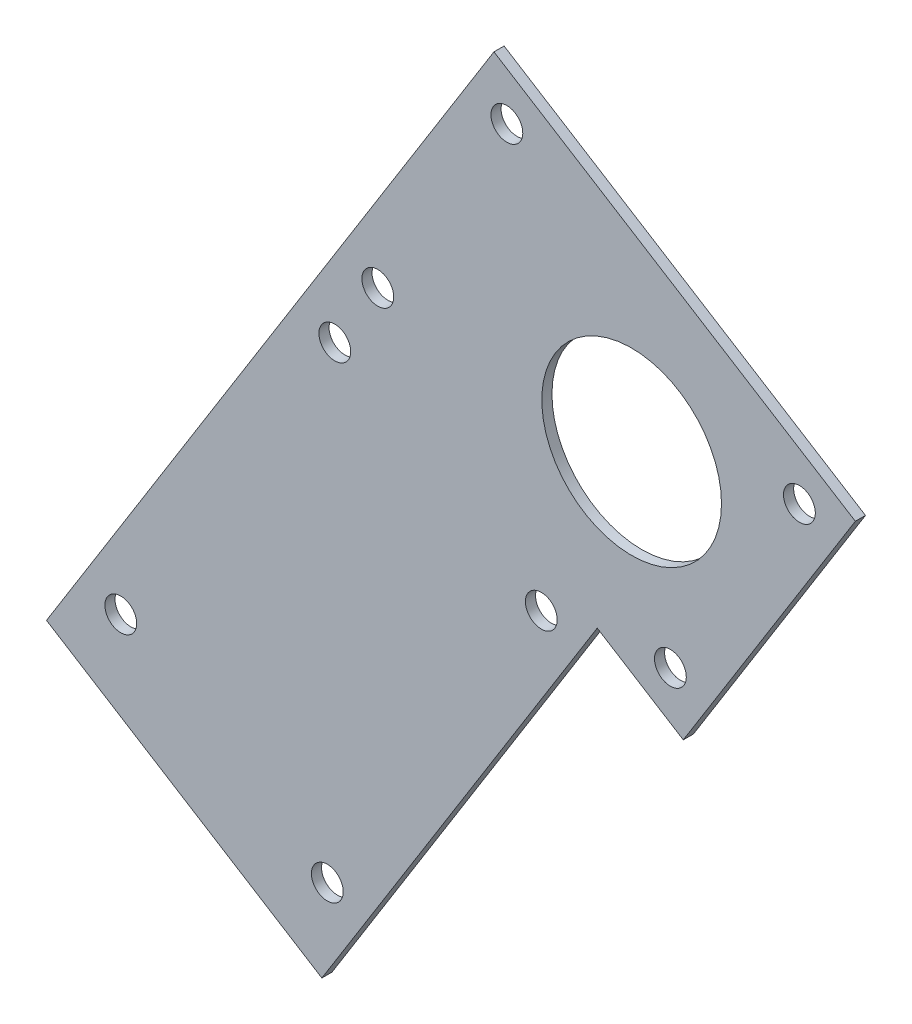
ISO-10303-21;
HEADER;
FILE_DESCRIPTION(('STEP AP214'),'2;1');
FILE_NAME('part.step','',(''),(''),'','','');
FILE_SCHEMA(('AUTOMOTIVE_DESIGN { 1 0 10303 214 1 1 1 1 }'));
ENDSEC;
DATA;
#1=APPLICATION_CONTEXT('core data for automotive mechanical design processes');
#2=APPLICATION_PROTOCOL_DEFINITION('international standard','automotive_design',2000,#1);
#3=PRODUCT_CONTEXT('',#1,'mechanical');
#4=PRODUCT('Part','Part','',(#3));
#5=PRODUCT_RELATED_PRODUCT_CATEGORY('part','',(#4));
#6=PRODUCT_DEFINITION_FORMATION('','',#4);
#7=PRODUCT_DEFINITION_CONTEXT('part definition',#1,'design');
#8=PRODUCT_DEFINITION('design','',#6,#7);
#9=PRODUCT_DEFINITION_SHAPE('','',#8);
#10=(LENGTH_UNIT() NAMED_UNIT(*) SI_UNIT(.MILLI.,.METRE.));
#11=(NAMED_UNIT(*) PLANE_ANGLE_UNIT() SI_UNIT($,.RADIAN.));
#12=(NAMED_UNIT(*) SI_UNIT($,.STERADIAN.) SOLID_ANGLE_UNIT());
#13=UNCERTAINTY_MEASURE_WITH_UNIT(LENGTH_MEASURE(1.E-05),#10,'distance_accuracy_value','');
#14=(GEOMETRIC_REPRESENTATION_CONTEXT(3) GLOBAL_UNCERTAINTY_ASSIGNED_CONTEXT((#13)) GLOBAL_UNIT_ASSIGNED_CONTEXT((#10,
#11,#12)) REPRESENTATION_CONTEXT('',''));
#15=CARTESIAN_POINT('',(0.,0.,0.));
#16=DIRECTION('',(0.,0.,1.));
#17=DIRECTION('',(1.,0.,0.));
#18=AXIS2_PLACEMENT_3D('',#15,#16,#17);
#19=CARTESIAN_POINT('',(-98.2473949678507,-122.099811751861,188.202492710166));
#20=DIRECTION('',(-0.848048096156436,0.529919264233189,0.));
#21=DIRECTION('',(-0.529919264233189,-0.848048096156436,0.));
#22=AXIS2_PLACEMENT_3D('',#19,#20,#21);
#23=PLANE('',#22);
#24=DIRECTION('',(-0.529919264233189,-0.848048096156436,0.));
#25=VECTOR('',#24,1.);
#26=CARTESIAN_POINT('',(-98.2473949678507,-122.099811751861,189.789992710167));
#27=LINE('',#26,#25);
#28=CARTESIAN_POINT('',(-98.2473949678507,-122.099811751861,189.789992710167));
#29=VERTEX_POINT('',#28);
#30=CARTESIAN_POINT('',(-141.33386625171,-191.05257948196,189.789992710167));
#31=VERTEX_POINT('',#30);
#32=EDGE_CURVE('E121',#29,#31,#27,.T.);
#33=ORIENTED_EDGE('',*,*,#32,.T.);
#34=DIRECTION('',(0.,0.,1.));
#35=VECTOR('',#34,1.);
#36=CARTESIAN_POINT('',(-141.33386625171,-191.05257948196,188.202492710166));
#37=LINE('',#36,#35);
#38=CARTESIAN_POINT('',(-141.33386625171,-191.05257948196,188.202492710166));
#39=VERTEX_POINT('',#38);
#40=EDGE_CURVE('E11',#39,#31,#37,.T.);
#41=ORIENTED_EDGE('',*,*,#40,.F.);
#42=DIRECTION('',(-0.529919264233189,-0.848048096156436,0.));
#43=VECTOR('',#42,1.);
#44=CARTESIAN_POINT('',(-98.2473949678507,-122.099811751861,188.202492710166));
#45=LINE('',#44,#43);
#46=CARTESIAN_POINT('',(-98.2473949678507,-122.099811751861,188.202492710166));
#47=VERTEX_POINT('',#46);
#48=EDGE_CURVE('E132',#47,#39,#45,.T.);
#49=ORIENTED_EDGE('',*,*,#48,.F.);
#50=DIRECTION('',(0.,0.,1.));
#51=VECTOR('',#50,1.);
#52=CARTESIAN_POINT('',(-98.2473949678507,-122.099811751861,188.202492710166));
#53=LINE('',#52,#51);
#54=EDGE_CURVE('E117',#47,#29,#53,.T.);
#55=ORIENTED_EDGE('',*,*,#54,.T.);
#56=EDGE_LOOP('',(#33,#41,#49,#55));
#57=FACE_BOUND('',#56,.T.);
#58=ADVANCED_FACE('F37',(#57),#23,.F.);
#59=CARTESIAN_POINT('',(-141.33386625171,-191.05257948196,188.202492710166));
#60=DIRECTION('',(0.529919264233189,0.848048096156436,0.));
#61=DIRECTION('',(-0.848048096156436,0.529919264233189,0.));
#62=AXIS2_PLACEMENT_3D('',#59,#60,#61);
#63=PLANE('',#62);
#64=DIRECTION('',(-0.848048096156436,0.529919264233189,0.));
#65=VECTOR('',#64,1.);
#66=CARTESIAN_POINT('',(-141.33386625171,-191.05257948196,189.789992710167));
#67=LINE('',#66,#65);
#68=CARTESIAN_POINT('',(-184.414709536457,-164.132680858914,189.789992710167));
#69=VERTEX_POINT('',#68);
#70=EDGE_CURVE('E124',#31,#69,#67,.T.);
#71=ORIENTED_EDGE('',*,*,#70,.T.);
#72=DIRECTION('',(0.,0.,1.));
#73=VECTOR('',#72,1.);
#74=CARTESIAN_POINT('',(-184.414709536457,-164.132680858914,188.202492710167));
#75=LINE('',#74,#73);
#76=CARTESIAN_POINT('',(-184.414709536457,-164.132680858914,188.202492710167));
#77=VERTEX_POINT('',#76);
#78=EDGE_CURVE('E45',#77,#69,#75,.T.);
#79=ORIENTED_EDGE('',*,*,#78,.F.);
#80=DIRECTION('',(-0.848048096156436,0.529919264233189,0.));
#81=VECTOR('',#80,1.);
#82=CARTESIAN_POINT('',(-141.33386625171,-191.05257948196,188.202492710166));
#83=LINE('',#82,#81);
#84=EDGE_CURVE('E90',#39,#77,#83,.T.);
#85=ORIENTED_EDGE('',*,*,#84,.F.);
#86=ORIENTED_EDGE('',*,*,#40,.T.);
#87=EDGE_LOOP('',(#71,#79,#85,#86));
#88=FACE_BOUND('',#87,.T.);
#89=ADVANCED_FACE('F157',(#88),#63,.F.);
#90=CARTESIAN_POINT('',(-184.414709536457,-164.132680858914,188.202492710167));
#91=DIRECTION('',(0.848048096156436,-0.529919264233189,0.));
#92=DIRECTION('',(0.529919264233189,0.848048096156436,0.));
#93=AXIS2_PLACEMENT_3D('',#90,#91,#92);
#94=PLANE('',#93);
#95=DIRECTION('',(0.529919264233189,0.848048096156436,0.));
#96=VECTOR('',#95,1.);
#97=CARTESIAN_POINT('',(-184.414709536457,-164.132680858914,189.789992710167));
#98=LINE('',#97,#96);
#99=CARTESIAN_POINT('',(-114.408339629552,-52.0990698440682,189.789992710167));
#100=VERTEX_POINT('',#99);
#101=EDGE_CURVE('E127',#69,#100,#98,.T.);
#102=ORIENTED_EDGE('',*,*,#101,.T.);
#103=DIRECTION('',(0.,0.,1.));
#104=VECTOR('',#103,1.);
#105=CARTESIAN_POINT('',(-114.408339629552,-52.0990698440682,188.202492710167));
#106=LINE('',#105,#104);
#107=CARTESIAN_POINT('',(-114.408339629552,-52.0990698440682,188.202492710167));
#108=VERTEX_POINT('',#107);
#109=EDGE_CURVE('E112',#108,#100,#106,.T.);
#110=ORIENTED_EDGE('',*,*,#109,.F.);
#111=DIRECTION('',(0.529919264233189,0.848048096156436,0.));
#112=VECTOR('',#111,1.);
#113=CARTESIAN_POINT('',(-184.414709536457,-164.132680858914,188.202492710167));
#114=LINE('',#113,#112);
#115=EDGE_CURVE('E103',#77,#108,#114,.T.);
#116=ORIENTED_EDGE('',*,*,#115,.F.);
#117=ORIENTED_EDGE('',*,*,#78,.T.);
#118=EDGE_LOOP('',(#102,#110,#116,#117));
#119=FACE_BOUND('',#118,.T.);
#120=ADVANCED_FACE('F138',(#119),#94,.F.);
#121=CARTESIAN_POINT('',(-114.408339629552,-52.0990698440682,188.202492710167));
#122=DIRECTION('',(-0.529919264233189,-0.848048096156436,0.));
#123=DIRECTION('',(0.848048096156436,-0.529919264233189,0.));
#124=AXIS2_PLACEMENT_3D('',#121,#122,#123);
#125=PLANE('',#124);
#126=DIRECTION('',(0.848048096156436,-0.529919264233189,0.));
#127=VECTOR('',#126,1.);
#128=CARTESIAN_POINT('',(-114.408339629552,-52.0990698440682,189.789992710167));
#129=LINE('',#128,#127);
#130=CARTESIAN_POINT('',(-57.8647328183212,-87.4314367868161,189.789992710167));
#131=VERTEX_POINT('',#130);
#132=EDGE_CURVE('E111',#100,#131,#129,.T.);
#133=ORIENTED_EDGE('',*,*,#132,.T.);
#134=DIRECTION('',(0.,0.,1.));
#135=VECTOR('',#134,1.);
#136=CARTESIAN_POINT('',(-57.8647328183212,-87.4314367868161,188.202492710166));
#137=LINE('',#136,#135);
#138=CARTESIAN_POINT('',(-57.8647328183212,-87.4314367868161,188.202492710166));
#139=VERTEX_POINT('',#138);
#140=EDGE_CURVE('E108',#139,#131,#137,.T.);
#141=ORIENTED_EDGE('',*,*,#140,.F.);
#142=DIRECTION('',(0.848048096156436,-0.529919264233189,0.));
#143=VECTOR('',#142,1.);
#144=CARTESIAN_POINT('',(-114.408339629552,-52.0990698440682,188.202492710167));
#145=LINE('',#144,#143);
#146=EDGE_CURVE('E97',#108,#139,#145,.T.);
#147=ORIENTED_EDGE('',*,*,#146,.F.);
#148=ORIENTED_EDGE('',*,*,#109,.T.);
#149=EDGE_LOOP('',(#133,#141,#147,#148));
#150=FACE_BOUND('',#149,.T.);
#151=ADVANCED_FACE('F109',(#150),#125,.F.);
#152=CARTESIAN_POINT('',(-57.8647328183212,-87.4314367868161,188.202492710166));
#153=DIRECTION('',(-0.848048096156436,0.52991926423319,0.));
#154=DIRECTION('',(-0.52991926423319,-0.848048096156436,0.));
#155=AXIS2_PLACEMENT_3D('',#152,#153,#154);
#156=PLANE('',#155);
#157=DIRECTION('',(-0.52991926423319,-0.848048096156436,0.));
#158=VECTOR('',#157,1.);
#159=CARTESIAN_POINT('',(-57.8647328183212,-87.4314367868161,189.789992710167));
#160=LINE('',#159,#158);
#161=CARTESIAN_POINT('',(-84.7846314413673,-130.512280071563,189.789992710167));
#162=VERTEX_POINT('',#161);
#163=EDGE_CURVE('E76',#131,#162,#160,.T.);
#164=ORIENTED_EDGE('',*,*,#163,.T.);
#165=DIRECTION('',(0.,0.,1.));
#166=VECTOR('',#165,1.);
#167=CARTESIAN_POINT('',(-84.7846314413673,-130.512280071563,188.202492710166));
#168=LINE('',#167,#166);
#169=CARTESIAN_POINT('',(-84.7846314413673,-130.512280071563,188.202492710166));
#170=VERTEX_POINT('',#169);
#171=EDGE_CURVE('E113',#170,#162,#168,.T.);
#172=ORIENTED_EDGE('',*,*,#171,.F.);
#173=DIRECTION('',(-0.52991926423319,-0.848048096156436,0.));
#174=VECTOR('',#173,1.);
#175=CARTESIAN_POINT('',(-57.8647328183212,-87.4314367868161,188.202492710166));
#176=LINE('',#175,#174);
#177=EDGE_CURVE('E101',#139,#170,#176,.T.);
#178=ORIENTED_EDGE('',*,*,#177,.F.);
#179=ORIENTED_EDGE('',*,*,#140,.T.);
#180=EDGE_LOOP('',(#164,#172,#178,#179));
#181=FACE_BOUND('',#180,.T.);
#182=ADVANCED_FACE('F115',(#181),#156,.F.);
#183=CARTESIAN_POINT('',(-84.7846314413673,-130.512280071563,188.202492710166));
#184=DIRECTION('',(0.529919264233185,0.848048096156439,0.));
#185=DIRECTION('',(-0.848048096156439,0.529919264233185,0.));
#186=AXIS2_PLACEMENT_3D('',#183,#184,#185);
#187=PLANE('',#186);
#188=DIRECTION('',(-0.848048096156439,0.529919264233185,0.));
#189=VECTOR('',#188,1.);
#190=CARTESIAN_POINT('',(-84.7846314413673,-130.512280071563,189.789992710167));
#191=LINE('',#190,#189);
#192=EDGE_CURVE('E82',#162,#29,#191,.T.);
#193=ORIENTED_EDGE('',*,*,#192,.T.);
#194=ORIENTED_EDGE('',*,*,#54,.F.);
#195=DIRECTION('',(-0.848048096156439,0.529919264233185,0.));
#196=VECTOR('',#195,1.);
#197=CARTESIAN_POINT('',(-84.7846314413673,-130.512280071563,188.202492710166));
#198=LINE('',#197,#196);
#199=EDGE_CURVE('E53',#170,#47,#198,.T.);
#200=ORIENTED_EDGE('',*,*,#199,.F.);
#201=ORIENTED_EDGE('',*,*,#171,.T.);
#202=EDGE_LOOP('',(#193,#194,#200,#201));
#203=FACE_BOUND('',#202,.T.);
#204=ADVANCED_FACE('F145',(#203),#187,.F.);
#205=CARTESIAN_POINT('',(0.,0.,188.202492710166));
#206=DIRECTION('',(0.,0.,-1.));
#207=DIRECTION('',(-1.,0.,0.));
#208=AXIS2_PLACEMENT_3D('',#205,#206,#207);
#209=PLANE('',#208);
#210=CARTESIAN_POINT('',(-66.6148255569677,-89.4515548694202,188.202492710166));
#211=DIRECTION('',(0.,0.,1.));
#212=DIRECTION('',(1.,0.,0.));
#213=AXIS2_PLACEMENT_3D('',#210,#211,#212);
#214=CIRCLE('',#213,2.4892);
#215=CARTESIAN_POINT('',(-64.1256255569677,-89.4515548694202,188.202492710166));
#216=VERTEX_POINT('',#215);
#217=EDGE_CURVE('E338',#216,#216,#214,.T.);
#218=ORIENTED_EDGE('',*,*,#217,.T.);
#219=EDGE_LOOP('',(#218));
#220=FACE_BOUND('',#219,.T.);
#221=CARTESIAN_POINT('',(-92.8651033414094,-95.5119093868654,188.202492710167));
#222=DIRECTION('',(0.,0.,-1.));
#223=DIRECTION('',(-1.,0.,0.));
#224=AXIS2_PLACEMENT_3D('',#221,#222,#223);
#225=CIRCLE('',#224,14.0571693338688);
#226=CARTESIAN_POINT('',(-106.922272675278,-95.5119093868654,188.202492710167));
#227=VERTEX_POINT('',#226);
#228=EDGE_CURVE('E348',#227,#227,#225,.T.);
#229=ORIENTED_EDGE('',*,*,#228,.F.);
#230=EDGE_LOOP('',(#229));
#231=FACE_BOUND('',#230,.T.);
#232=CARTESIAN_POINT('',(-106.997487706325,-124.119929834574,188.202492710166));
#233=DIRECTION('',(0.,0.,-1.));
#234=DIRECTION('',(0.,1.,0.));
#235=AXIS2_PLACEMENT_3D('',#232,#233,#234);
#236=CIRCLE('',#235,2.48919999999998);
#237=CARTESIAN_POINT('',(-106.997487706325,-121.630729834574,188.202492710166));
#238=VERTEX_POINT('',#237);
#239=EDGE_CURVE('E351',#238,#238,#236,.T.);
#240=ORIENTED_EDGE('',*,*,#239,.F.);
#241=EDGE_LOOP('',(#240));
#242=FACE_BOUND('',#241,.T.);
#243=CARTESIAN_POINT('',(-86.8047495242526,-121.762187332981,188.202492710166));
#244=DIRECTION('',(0.,0.,-1.));
#245=DIRECTION('',(0.,1.,0.));
#246=AXIS2_PLACEMENT_3D('',#243,#244,#245);
#247=CIRCLE('',#246,2.48919999999998);
#248=CARTESIAN_POINT('',(-86.8047495242526,-119.272987332981,188.202492710166));
#249=VERTEX_POINT('',#248);
#250=EDGE_CURVE('E357',#249,#249,#247,.T.);
#251=ORIENTED_EDGE('',*,*,#250,.F.);
#252=EDGE_LOOP('',(#251));
#253=FACE_BOUND('',#252,.T.);
#254=CARTESIAN_POINT('',(-112.388221547011,-60.8491625824337,188.202492710167));
#255=DIRECTION('',(0.,0.,-1.));
#256=DIRECTION('',(0.,1.,0.));
#257=AXIS2_PLACEMENT_3D('',#254,#255,#256);
#258=CIRCLE('',#257,2.48919999999998);
#259=CARTESIAN_POINT('',(-112.388221547011,-58.3599625824337,188.202492710167));
#260=VERTEX_POINT('',#259);
#261=EDGE_CURVE('E363',#260,#260,#258,.T.);
#262=ORIENTED_EDGE('',*,*,#261,.F.);
#263=EDGE_LOOP('',(#262));
#264=FACE_BOUND('',#263,.T.);
#265=CARTESIAN_POINT('',(-132.578145514296,-93.1597950459946,188.202492710167));
#266=DIRECTION('',(0.,0.,-1.));
#267=DIRECTION('',(0.,1.,0.));
#268=AXIS2_PLACEMENT_3D('',#265,#266,#267);
#269=CIRCLE('',#268,2.4892);
#270=CARTESIAN_POINT('',(-132.578145514296,-90.6705950459946,188.202492710167));
#271=VERTEX_POINT('',#270);
#272=EDGE_CURVE('E369',#271,#271,#269,.T.);
#273=ORIENTED_EDGE('',*,*,#272,.F.);
#274=EDGE_LOOP('',(#273));
#275=FACE_BOUND('',#274,.T.);
#276=CARTESIAN_POINT('',(-139.308120169886,-103.93000586729,188.202492710167));
#277=DIRECTION('',(0.,0.,-1.));
#278=DIRECTION('',(0.,1.,0.));
#279=AXIS2_PLACEMENT_3D('',#276,#277,#278);
#280=CIRCLE('',#279,2.4892);
#281=CARTESIAN_POINT('',(-139.308120169886,-101.44080586729,188.202492710167));
#282=VERTEX_POINT('',#281);
#283=EDGE_CURVE('E375',#282,#282,#280,.T.);
#284=ORIENTED_EDGE('',*,*,#283,.F.);
#285=EDGE_LOOP('',(#284));
#286=FACE_BOUND('',#285,.T.);
#287=CARTESIAN_POINT('',(-172.7920863334,-157.515553088009,188.202492710167));
#288=DIRECTION('',(0.,0.,-1.));
#289=DIRECTION('',(0.,1.,0.));
#290=AXIS2_PLACEMENT_3D('',#287,#288,#289);
#291=CIRCLE('',#290,2.4892);
#292=CARTESIAN_POINT('',(-172.7920863334,-155.026353088009,188.202492710167));
#293=VERTEX_POINT('',#292);
#294=EDGE_CURVE('E381',#293,#293,#291,.T.);
#295=ORIENTED_EDGE('',*,*,#294,.F.);
#296=EDGE_LOOP('',(#295));
#297=FACE_BOUND('',#296,.T.);
#298=CARTESIAN_POINT('',(-140.481453869839,-177.705477055293,188.202492710166));
#299=DIRECTION('',(0.,0.,-1.));
#300=DIRECTION('',(0.,1.,0.));
#301=AXIS2_PLACEMENT_3D('',#298,#299,#300);
#302=CIRCLE('',#301,2.4892);
#303=CARTESIAN_POINT('',(-140.481453869839,-175.216277055293,188.202492710166));
#304=VERTEX_POINT('',#303);
#305=EDGE_CURVE('E387',#304,#304,#302,.T.);
#306=ORIENTED_EDGE('',*,*,#305,.F.);
#307=EDGE_LOOP('',(#306));
#308=FACE_BOUND('',#307,.T.);
#309=ORIENTED_EDGE('',*,*,#48,.T.);
#310=ORIENTED_EDGE('',*,*,#84,.T.);
#311=ORIENTED_EDGE('',*,*,#115,.T.);
#312=ORIENTED_EDGE('',*,*,#146,.T.);
#313=ORIENTED_EDGE('',*,*,#177,.T.);
#314=ORIENTED_EDGE('',*,*,#199,.T.);
#315=EDGE_LOOP('',(#309,#310,#311,#312,#313,#314));
#316=FACE_BOUND('',#315,.T.);
#317=ADVANCED_FACE('F99',(#220,#231,#242,#253,#264,#275,#286,#297,#308,#316),#209,.T.);
#318=CARTESIAN_POINT('',(0.,0.,189.789992710167));
#319=DIRECTION('',(0.,0.,-1.));
#320=DIRECTION('',(-1.,0.,0.));
#321=AXIS2_PLACEMENT_3D('',#318,#319,#320);
#322=PLANE('',#321);
#323=CARTESIAN_POINT('',(-66.6148255569677,-89.4515548694202,189.789992710167));
#324=DIRECTION('',(0.,0.,1.));
#325=DIRECTION('',(1.,0.,0.));
#326=AXIS2_PLACEMENT_3D('',#323,#324,#325);
#327=CIRCLE('',#326,2.48919999999998);
#328=CARTESIAN_POINT('',(-64.1256255569677,-89.4515548694202,189.789992710167));
#329=VERTEX_POINT('',#328);
#330=EDGE_CURVE('E341',#329,#329,#327,.T.);
#331=ORIENTED_EDGE('',*,*,#330,.F.);
#332=EDGE_LOOP('',(#331));
#333=FACE_BOUND('',#332,.T.);
#334=CARTESIAN_POINT('',(-92.8651033414094,-95.5119093868654,189.789992710167));
#335=DIRECTION('',(0.,0.,1.));
#336=DIRECTION('',(1.,0.,0.));
#337=AXIS2_PLACEMENT_3D('',#334,#335,#336);
#338=CIRCLE('',#337,14.0571693338688);
#339=CARTESIAN_POINT('',(-78.8079340075406,-95.5119093868654,189.789992710167));
#340=VERTEX_POINT('',#339);
#341=EDGE_CURVE('E343',#340,#340,#338,.T.);
#342=ORIENTED_EDGE('',*,*,#341,.F.);
#343=EDGE_LOOP('',(#342));
#344=FACE_BOUND('',#343,.T.);
#345=CARTESIAN_POINT('',(-106.997487706325,-124.119929834574,189.789992710167));
#346=DIRECTION('',(0.,0.,-1.));
#347=DIRECTION('',(0.,1.,0.));
#348=AXIS2_PLACEMENT_3D('',#345,#346,#347);
#349=CIRCLE('',#348,2.4892);
#350=CARTESIAN_POINT('',(-106.997487706325,-121.630729834574,189.789992710167));
#351=VERTEX_POINT('',#350);
#352=EDGE_CURVE('E354',#351,#351,#349,.T.);
#353=ORIENTED_EDGE('',*,*,#352,.T.);
#354=EDGE_LOOP('',(#353));
#355=FACE_BOUND('',#354,.T.);
#356=CARTESIAN_POINT('',(-86.8047495242526,-121.762187332981,189.789992710167));
#357=DIRECTION('',(0.,0.,-1.));
#358=DIRECTION('',(0.,1.,0.));
#359=AXIS2_PLACEMENT_3D('',#356,#357,#358);
#360=CIRCLE('',#359,2.4892);
#361=CARTESIAN_POINT('',(-86.8047495242526,-119.272987332981,189.789992710167));
#362=VERTEX_POINT('',#361);
#363=EDGE_CURVE('E360',#362,#362,#360,.T.);
#364=ORIENTED_EDGE('',*,*,#363,.T.);
#365=EDGE_LOOP('',(#364));
#366=FACE_BOUND('',#365,.T.);
#367=CARTESIAN_POINT('',(-112.388221547011,-60.8491625824337,189.789992710167));
#368=DIRECTION('',(0.,0.,-1.));
#369=DIRECTION('',(0.,1.,0.));
#370=AXIS2_PLACEMENT_3D('',#367,#368,#369);
#371=CIRCLE('',#370,2.4892);
#372=CARTESIAN_POINT('',(-112.388221547011,-58.3599625824337,189.789992710167));
#373=VERTEX_POINT('',#372);
#374=EDGE_CURVE('E366',#373,#373,#371,.T.);
#375=ORIENTED_EDGE('',*,*,#374,.T.);
#376=EDGE_LOOP('',(#375));
#377=FACE_BOUND('',#376,.T.);
#378=CARTESIAN_POINT('',(-132.578145514296,-93.1597950459946,189.789992710167));
#379=DIRECTION('',(0.,0.,-1.));
#380=DIRECTION('',(0.,1.,0.));
#381=AXIS2_PLACEMENT_3D('',#378,#379,#380);
#382=CIRCLE('',#381,2.4892);
#383=CARTESIAN_POINT('',(-132.578145514296,-90.6705950459946,189.789992710167));
#384=VERTEX_POINT('',#383);
#385=EDGE_CURVE('E372',#384,#384,#382,.T.);
#386=ORIENTED_EDGE('',*,*,#385,.T.);
#387=EDGE_LOOP('',(#386));
#388=FACE_BOUND('',#387,.T.);
#389=CARTESIAN_POINT('',(-139.308120169886,-103.93000586729,189.789992710167));
#390=DIRECTION('',(0.,0.,-1.));
#391=DIRECTION('',(0.,1.,0.));
#392=AXIS2_PLACEMENT_3D('',#389,#390,#391);
#393=CIRCLE('',#392,2.4892);
#394=CARTESIAN_POINT('',(-139.308120169886,-101.44080586729,189.789992710167));
#395=VERTEX_POINT('',#394);
#396=EDGE_CURVE('E378',#395,#395,#393,.T.);
#397=ORIENTED_EDGE('',*,*,#396,.T.);
#398=EDGE_LOOP('',(#397));
#399=FACE_BOUND('',#398,.T.);
#400=CARTESIAN_POINT('',(-172.7920863334,-157.515553088009,189.789992710167));
#401=DIRECTION('',(0.,0.,-1.));
#402=DIRECTION('',(0.,1.,0.));
#403=AXIS2_PLACEMENT_3D('',#400,#401,#402);
#404=CIRCLE('',#403,2.4892);
#405=CARTESIAN_POINT('',(-172.7920863334,-155.026353088009,189.789992710167));
#406=VERTEX_POINT('',#405);
#407=EDGE_CURVE('E384',#406,#406,#404,.T.);
#408=ORIENTED_EDGE('',*,*,#407,.T.);
#409=EDGE_LOOP('',(#408));
#410=FACE_BOUND('',#409,.T.);
#411=CARTESIAN_POINT('',(-140.481453869839,-177.705477055293,189.789992710167));
#412=DIRECTION('',(0.,0.,-1.));
#413=DIRECTION('',(0.,1.,0.));
#414=AXIS2_PLACEMENT_3D('',#411,#412,#413);
#415=CIRCLE('',#414,2.4892);
#416=CARTESIAN_POINT('',(-140.481453869839,-175.216277055293,189.789992710167));
#417=VERTEX_POINT('',#416);
#418=EDGE_CURVE('E125',#417,#417,#415,.T.);
#419=ORIENTED_EDGE('',*,*,#418,.T.);
#420=EDGE_LOOP('',(#419));
#421=FACE_BOUND('',#420,.T.);
#422=ORIENTED_EDGE('',*,*,#32,.F.);
#423=ORIENTED_EDGE('',*,*,#192,.F.);
#424=ORIENTED_EDGE('',*,*,#163,.F.);
#425=ORIENTED_EDGE('',*,*,#132,.F.);
#426=ORIENTED_EDGE('',*,*,#101,.F.);
#427=ORIENTED_EDGE('',*,*,#70,.F.);
#428=EDGE_LOOP('',(#422,#423,#424,#425,#426,#427));
#429=FACE_BOUND('',#428,.T.);
#430=ADVANCED_FACE('F141',(#333,#344,#355,#366,#377,#388,#399,#410,#421,#429),#322,.F.);
#431=CARTESIAN_POINT('',(-140.481453869839,-177.705477055293,188.202492710166));
#432=DIRECTION('',(0.,0.,-1.));
#433=DIRECTION('',(0.,1.,0.));
#434=AXIS2_PLACEMENT_3D('',#431,#432,#433);
#435=CYLINDRICAL_SURFACE('',#434,2.4892);
#436=ORIENTED_EDGE('',*,*,#418,.F.);
#437=EDGE_LOOP('',(#436));
#438=FACE_BOUND('',#437,.T.);
#439=ORIENTED_EDGE('',*,*,#305,.T.);
#440=EDGE_LOOP('',(#439));
#441=FACE_BOUND('',#440,.T.);
#442=ADVANCED_FACE('F187',(#438,#441),#435,.F.);
#443=CARTESIAN_POINT('',(-172.7920863334,-157.515553088009,188.202492710167));
#444=DIRECTION('',(0.,0.,-1.));
#445=DIRECTION('',(0.,1.,0.));
#446=AXIS2_PLACEMENT_3D('',#443,#444,#445);
#447=CYLINDRICAL_SURFACE('',#446,2.4892);
#448=ORIENTED_EDGE('',*,*,#407,.F.);
#449=EDGE_LOOP('',(#448));
#450=FACE_BOUND('',#449,.T.);
#451=ORIENTED_EDGE('',*,*,#294,.T.);
#452=EDGE_LOOP('',(#451));
#453=FACE_BOUND('',#452,.T.);
#454=ADVANCED_FACE('F192',(#450,#453),#447,.F.);
#455=CARTESIAN_POINT('',(-139.308120169886,-103.93000586729,188.202492710167));
#456=DIRECTION('',(0.,0.,-1.));
#457=DIRECTION('',(0.,1.,0.));
#458=AXIS2_PLACEMENT_3D('',#455,#456,#457);
#459=CYLINDRICAL_SURFACE('',#458,2.4892);
#460=ORIENTED_EDGE('',*,*,#396,.F.);
#461=EDGE_LOOP('',(#460));
#462=FACE_BOUND('',#461,.T.);
#463=ORIENTED_EDGE('',*,*,#283,.T.);
#464=EDGE_LOOP('',(#463));
#465=FACE_BOUND('',#464,.T.);
#466=ADVANCED_FACE('F205',(#462,#465),#459,.F.);
#467=CARTESIAN_POINT('',(-132.578145514296,-93.1597950459946,188.202492710167));
#468=DIRECTION('',(0.,0.,-1.));
#469=DIRECTION('',(0.,1.,0.));
#470=AXIS2_PLACEMENT_3D('',#467,#468,#469);
#471=CYLINDRICAL_SURFACE('',#470,2.4892);
#472=ORIENTED_EDGE('',*,*,#385,.F.);
#473=EDGE_LOOP('',(#472));
#474=FACE_BOUND('',#473,.T.);
#475=ORIENTED_EDGE('',*,*,#272,.T.);
#476=EDGE_LOOP('',(#475));
#477=FACE_BOUND('',#476,.T.);
#478=ADVANCED_FACE('F216',(#474,#477),#471,.F.);
#479=CARTESIAN_POINT('',(-112.388221547011,-60.8491625824337,188.202492710167));
#480=DIRECTION('',(0.,0.,-1.));
#481=DIRECTION('',(0.,1.,0.));
#482=AXIS2_PLACEMENT_3D('',#479,#480,#481);
#483=CYLINDRICAL_SURFACE('',#482,2.48919999999999);
#484=ORIENTED_EDGE('',*,*,#374,.F.);
#485=EDGE_LOOP('',(#484));
#486=FACE_BOUND('',#485,.T.);
#487=ORIENTED_EDGE('',*,*,#261,.T.);
#488=EDGE_LOOP('',(#487));
#489=FACE_BOUND('',#488,.T.);
#490=ADVANCED_FACE('F227',(#486,#489),#483,.F.);
#491=CARTESIAN_POINT('',(-86.8047495242526,-121.762187332981,188.202492710166));
#492=DIRECTION('',(0.,0.,-1.));
#493=DIRECTION('',(0.,1.,0.));
#494=AXIS2_PLACEMENT_3D('',#491,#492,#493);
#495=CYLINDRICAL_SURFACE('',#494,2.48919999999999);
#496=ORIENTED_EDGE('',*,*,#363,.F.);
#497=EDGE_LOOP('',(#496));
#498=FACE_BOUND('',#497,.T.);
#499=ORIENTED_EDGE('',*,*,#250,.T.);
#500=EDGE_LOOP('',(#499));
#501=FACE_BOUND('',#500,.T.);
#502=ADVANCED_FACE('F238',(#498,#501),#495,.F.);
#503=CARTESIAN_POINT('',(-106.997487706325,-124.119929834574,188.202492710166));
#504=DIRECTION('',(0.,0.,-1.));
#505=DIRECTION('',(0.,1.,0.));
#506=AXIS2_PLACEMENT_3D('',#503,#504,#505);
#507=CYLINDRICAL_SURFACE('',#506,2.48919999999999);
#508=ORIENTED_EDGE('',*,*,#352,.F.);
#509=EDGE_LOOP('',(#508));
#510=FACE_BOUND('',#509,.T.);
#511=ORIENTED_EDGE('',*,*,#239,.T.);
#512=EDGE_LOOP('',(#511));
#513=FACE_BOUND('',#512,.T.);
#514=ADVANCED_FACE('F249',(#510,#513),#507,.F.);
#515=CARTESIAN_POINT('',(-92.8651033414094,-95.5119093868654,187.249992710167));
#516=DIRECTION('',(0.,0.,1.));
#517=DIRECTION('',(1.,0.,0.));
#518=AXIS2_PLACEMENT_3D('',#515,#516,#517);
#519=CYLINDRICAL_SURFACE('',#518,14.0571693338688);
#520=ORIENTED_EDGE('',*,*,#228,.T.);
#521=EDGE_LOOP('',(#520));
#522=FACE_BOUND('',#521,.T.);
#523=ORIENTED_EDGE('',*,*,#341,.T.);
#524=EDGE_LOOP('',(#523));
#525=FACE_BOUND('',#524,.T.);
#526=ADVANCED_FACE('F260',(#522,#525),#519,.F.);
#527=CARTESIAN_POINT('',(-66.6148255569677,-89.4515548694202,189.789992710167));
#528=DIRECTION('',(0.,0.,1.));
#529=DIRECTION('',(1.,0.,0.));
#530=AXIS2_PLACEMENT_3D('',#527,#528,#529);
#531=CYLINDRICAL_SURFACE('',#530,2.48919999999999);
#532=ORIENTED_EDGE('',*,*,#217,.F.);
#533=EDGE_LOOP('',(#532));
#534=FACE_BOUND('',#533,.T.);
#535=ORIENTED_EDGE('',*,*,#330,.T.);
#536=EDGE_LOOP('',(#535));
#537=FACE_BOUND('',#536,.T.);
#538=ADVANCED_FACE('F271',(#534,#537),#531,.F.);
#539=CLOSED_SHELL('',(#58,#89,#120,#151,#182,#204,#317,#430,#442,#454,#466,#478,#490,#502,#514,
#526,#538));
#540=MANIFOLD_SOLID_BREP('B2',#539);
#541=ADVANCED_BREP_SHAPE_REPRESENTATION('',(#18,#540),#14);
#542=SHAPE_DEFINITION_REPRESENTATION(#9,#541);
ENDSEC;
END-ISO-10303-21;
